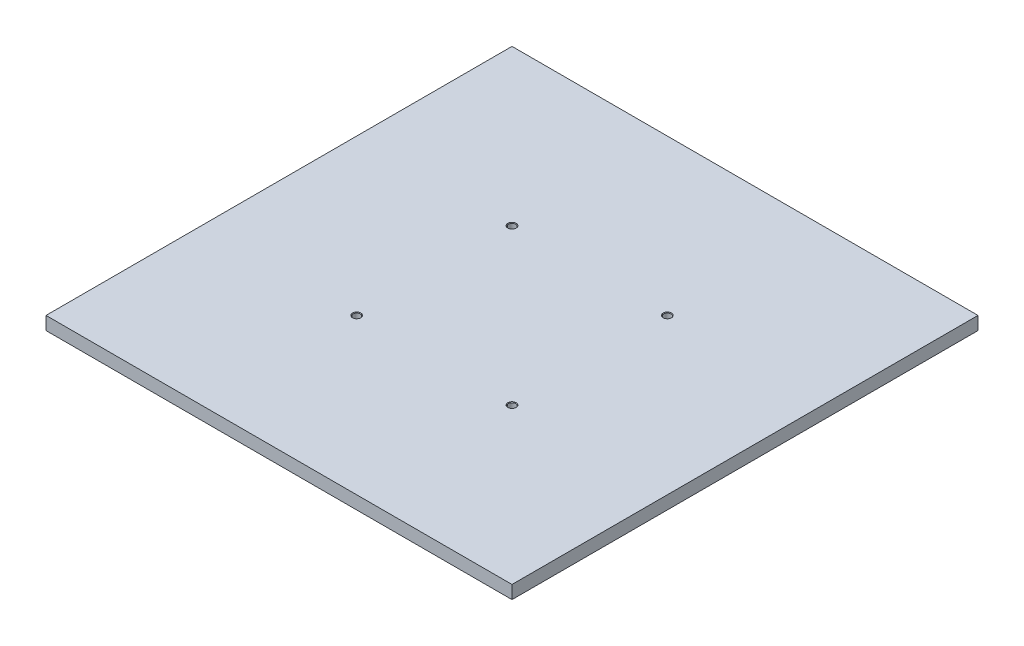
ISO-10303-21;
HEADER;
FILE_DESCRIPTION(('STEP AP214'),'2;1');
FILE_NAME('part.step','',(''),(''),'','','');
FILE_SCHEMA(('AUTOMOTIVE_DESIGN { 1 0 10303 214 1 1 1 1 }'));
ENDSEC;
DATA;
#1=APPLICATION_CONTEXT('core data for automotive mechanical design processes');
#2=APPLICATION_PROTOCOL_DEFINITION('international standard','automotive_design',2000,#1);
#3=PRODUCT_CONTEXT('',#1,'mechanical');
#4=PRODUCT('Part','Part','',(#3));
#5=PRODUCT_RELATED_PRODUCT_CATEGORY('part','',(#4));
#6=PRODUCT_DEFINITION_FORMATION('','',#4);
#7=PRODUCT_DEFINITION_CONTEXT('part definition',#1,'design');
#8=PRODUCT_DEFINITION('design','',#6,#7);
#9=PRODUCT_DEFINITION_SHAPE('','',#8);
#10=(LENGTH_UNIT() NAMED_UNIT(*) SI_UNIT(.MILLI.,.METRE.));
#11=(NAMED_UNIT(*) PLANE_ANGLE_UNIT() SI_UNIT($,.RADIAN.));
#12=(NAMED_UNIT(*) SI_UNIT($,.STERADIAN.) SOLID_ANGLE_UNIT());
#13=UNCERTAINTY_MEASURE_WITH_UNIT(LENGTH_MEASURE(1.E-05),#10,'distance_accuracy_value','');
#14=(GEOMETRIC_REPRESENTATION_CONTEXT(3) GLOBAL_UNCERTAINTY_ASSIGNED_CONTEXT((#13)) GLOBAL_UNIT_ASSIGNED_CONTEXT((#10,
#11,#12)) REPRESENTATION_CONTEXT('',''));
#15=CARTESIAN_POINT('',(0.,0.,0.));
#16=DIRECTION('',(0.,0.,1.));
#17=DIRECTION('',(1.,0.,0.));
#18=AXIS2_PLACEMENT_3D('',#15,#16,#17);
#19=CARTESIAN_POINT('',(225.,12.7,225.));
#20=DIRECTION('',(-1.,0.,0.));
#21=DIRECTION('',(0.,0.,1.));
#22=AXIS2_PLACEMENT_3D('',#19,#20,#21);
#23=PLANE('',#22);
#24=DIRECTION('',(0.,0.,-1.));
#25=VECTOR('',#24,1.);
#26=CARTESIAN_POINT('',(225.,0.,225.));
#27=LINE('',#26,#25);
#28=CARTESIAN_POINT('',(225.,0.,225.));
#29=VERTEX_POINT('',#28);
#30=CARTESIAN_POINT('',(225.,0.,-225.));
#31=VERTEX_POINT('',#30);
#32=EDGE_CURVE('E97',#29,#31,#27,.T.);
#33=ORIENTED_EDGE('',*,*,#32,.T.);
#34=DIRECTION('',(0.,-1.,0.));
#35=VECTOR('',#34,1.);
#36=CARTESIAN_POINT('',(225.,12.7,-225.));
#37=LINE('',#36,#35);
#38=CARTESIAN_POINT('',(225.,12.7,-225.));
#39=VERTEX_POINT('',#38);
#40=EDGE_CURVE('E11',#39,#31,#37,.T.);
#41=ORIENTED_EDGE('',*,*,#40,.F.);
#42=DIRECTION('',(0.,0.,-1.));
#43=VECTOR('',#42,1.);
#44=CARTESIAN_POINT('',(225.,12.7,225.));
#45=LINE('',#44,#43);
#46=CARTESIAN_POINT('',(225.,12.7,225.));
#47=VERTEX_POINT('',#46);
#48=EDGE_CURVE('E85',#47,#39,#45,.T.);
#49=ORIENTED_EDGE('',*,*,#48,.F.);
#50=DIRECTION('',(0.,-1.,0.));
#51=VECTOR('',#50,1.);
#52=CARTESIAN_POINT('',(225.,12.7,225.));
#53=LINE('',#52,#51);
#54=EDGE_CURVE('E93',#47,#29,#53,.T.);
#55=ORIENTED_EDGE('',*,*,#54,.T.);
#56=EDGE_LOOP('',(#33,#41,#49,#55));
#57=FACE_BOUND('',#56,.T.);
#58=ADVANCED_FACE('F34',(#57),#23,.F.);
#59=CARTESIAN_POINT('',(-225.,12.7,-225.));
#60=DIRECTION('',(0.,0.,1.));
#61=DIRECTION('',(1.,0.,0.));
#62=AXIS2_PLACEMENT_3D('',#59,#60,#61);
#63=PLANE('',#62);
#64=DIRECTION('',(-1.,0.,0.));
#65=VECTOR('',#64,1.);
#66=CARTESIAN_POINT('',(-225.,0.,-225.));
#67=LINE('',#66,#65);
#68=CARTESIAN_POINT('',(-225.,0.,-225.));
#69=VERTEX_POINT('',#68);
#70=EDGE_CURVE('E89',#31,#69,#67,.T.);
#71=ORIENTED_EDGE('',*,*,#70,.T.);
#72=DIRECTION('',(0.,-1.,0.));
#73=VECTOR('',#72,1.);
#74=CARTESIAN_POINT('',(-225.,12.7,-225.));
#75=LINE('',#74,#73);
#76=CARTESIAN_POINT('',(-225.,12.7,-225.));
#77=VERTEX_POINT('',#76);
#78=EDGE_CURVE('E42',#77,#69,#75,.T.);
#79=ORIENTED_EDGE('',*,*,#78,.F.);
#80=DIRECTION('',(-1.,0.,0.));
#81=VECTOR('',#80,1.);
#82=CARTESIAN_POINT('',(-225.,12.7,-225.));
#83=LINE('',#82,#81);
#84=EDGE_CURVE('E80',#39,#77,#83,.T.);
#85=ORIENTED_EDGE('',*,*,#84,.F.);
#86=ORIENTED_EDGE('',*,*,#40,.T.);
#87=EDGE_LOOP('',(#71,#79,#85,#86));
#88=FACE_BOUND('',#87,.T.);
#89=ADVANCED_FACE('F88',(#88),#63,.F.);
#90=CARTESIAN_POINT('',(-225.,12.7,225.));
#91=DIRECTION('',(1.,0.,0.));
#92=DIRECTION('',(0.,0.,-1.));
#93=AXIS2_PLACEMENT_3D('',#90,#91,#92);
#94=PLANE('',#93);
#95=DIRECTION('',(0.,0.,1.));
#96=VECTOR('',#95,1.);
#97=CARTESIAN_POINT('',(-225.,0.,225.));
#98=LINE('',#97,#96);
#99=CARTESIAN_POINT('',(-225.,0.,225.));
#100=VERTEX_POINT('',#99);
#101=EDGE_CURVE('E67',#69,#100,#98,.T.);
#102=ORIENTED_EDGE('',*,*,#101,.T.);
#103=DIRECTION('',(0.,-1.,0.));
#104=VECTOR('',#103,1.);
#105=CARTESIAN_POINT('',(-225.,12.7,225.));
#106=LINE('',#105,#104);
#107=CARTESIAN_POINT('',(-225.,12.7,225.));
#108=VERTEX_POINT('',#107);
#109=EDGE_CURVE('E90',#108,#100,#106,.T.);
#110=ORIENTED_EDGE('',*,*,#109,.F.);
#111=DIRECTION('',(0.,0.,1.));
#112=VECTOR('',#111,1.);
#113=CARTESIAN_POINT('',(-225.,12.7,225.));
#114=LINE('',#113,#112);
#115=EDGE_CURVE('E83',#77,#108,#114,.T.);
#116=ORIENTED_EDGE('',*,*,#115,.F.);
#117=ORIENTED_EDGE('',*,*,#78,.T.);
#118=EDGE_LOOP('',(#102,#110,#116,#117));
#119=FACE_BOUND('',#118,.T.);
#120=ADVANCED_FACE('F91',(#119),#94,.F.);
#121=CARTESIAN_POINT('',(-225.,12.7,225.));
#122=DIRECTION('',(0.,0.,-1.));
#123=DIRECTION('',(-1.,0.,0.));
#124=AXIS2_PLACEMENT_3D('',#121,#122,#123);
#125=PLANE('',#124);
#126=DIRECTION('',(1.,0.,0.));
#127=VECTOR('',#126,1.);
#128=CARTESIAN_POINT('',(-225.,0.,225.));
#129=LINE('',#128,#127);
#130=EDGE_CURVE('E73',#100,#29,#129,.T.);
#131=ORIENTED_EDGE('',*,*,#130,.T.);
#132=ORIENTED_EDGE('',*,*,#54,.F.);
#133=DIRECTION('',(1.,0.,0.));
#134=VECTOR('',#133,1.);
#135=CARTESIAN_POINT('',(-225.,12.7,225.));
#136=LINE('',#135,#134);
#137=EDGE_CURVE('E50',#108,#47,#136,.T.);
#138=ORIENTED_EDGE('',*,*,#137,.F.);
#139=ORIENTED_EDGE('',*,*,#109,.T.);
#140=EDGE_LOOP('',(#131,#132,#138,#139));
#141=FACE_BOUND('',#140,.T.);
#142=ADVANCED_FACE('F105',(#141),#125,.F.);
#143=CARTESIAN_POINT('',(0.,12.7,0.));
#144=DIRECTION('',(0.,-1.,0.));
#145=DIRECTION('',(0.,0.,-1.));
#146=AXIS2_PLACEMENT_3D('',#143,#144,#145);
#147=PLANE('',#146);
#148=CARTESIAN_POINT('',(-75.,12.7,-75.));
#149=DIRECTION('',(0.,1.,0.));
#150=DIRECTION('',(0.,0.,1.));
#151=AXIS2_PLACEMENT_3D('',#148,#149,#150);
#152=CIRCLE('',#151,4.025);
#153=CARTESIAN_POINT('',(-75.,12.7,-70.975));
#154=VERTEX_POINT('',#153);
#155=EDGE_CURVE('E143',#154,#154,#152,.T.);
#156=ORIENTED_EDGE('',*,*,#155,.F.);
#157=EDGE_LOOP('',(#156));
#158=FACE_BOUND('',#157,.T.);
#159=CARTESIAN_POINT('',(75.,12.7,-75.));
#160=DIRECTION('',(0.,1.,0.));
#161=DIRECTION('',(0.,0.,1.));
#162=AXIS2_PLACEMENT_3D('',#159,#160,#161);
#163=CIRCLE('',#162,4.025);
#164=CARTESIAN_POINT('',(75.,12.7,-70.975));
#165=VERTEX_POINT('',#164);
#166=EDGE_CURVE('E134',#165,#165,#163,.T.);
#167=ORIENTED_EDGE('',*,*,#166,.F.);
#168=EDGE_LOOP('',(#167));
#169=FACE_BOUND('',#168,.T.);
#170=CARTESIAN_POINT('',(75.,12.7,75.));
#171=DIRECTION('',(0.,1.,0.));
#172=DIRECTION('',(0.,0.,1.));
#173=AXIS2_PLACEMENT_3D('',#170,#171,#172);
#174=CIRCLE('',#173,4.025);
#175=CARTESIAN_POINT('',(75.,12.7,79.025));
#176=VERTEX_POINT('',#175);
#177=EDGE_CURVE('E125',#176,#176,#174,.T.);
#178=ORIENTED_EDGE('',*,*,#177,.F.);
#179=EDGE_LOOP('',(#178));
#180=FACE_BOUND('',#179,.T.);
#181=CARTESIAN_POINT('',(-75.,12.7,75.));
#182=DIRECTION('',(0.,1.,0.));
#183=DIRECTION('',(0.,0.,1.));
#184=AXIS2_PLACEMENT_3D('',#181,#182,#183);
#185=CIRCLE('',#184,4.025);
#186=CARTESIAN_POINT('',(-75.,12.7,79.025));
#187=VERTEX_POINT('',#186);
#188=EDGE_CURVE('E116',#187,#187,#185,.T.);
#189=ORIENTED_EDGE('',*,*,#188,.F.);
#190=EDGE_LOOP('',(#189));
#191=FACE_BOUND('',#190,.T.);
#192=ORIENTED_EDGE('',*,*,#48,.T.);
#193=ORIENTED_EDGE('',*,*,#84,.T.);
#194=ORIENTED_EDGE('',*,*,#115,.T.);
#195=ORIENTED_EDGE('',*,*,#137,.T.);
#196=EDGE_LOOP('',(#192,#193,#194,#195));
#197=FACE_BOUND('',#196,.T.);
#198=ADVANCED_FACE('F81',(#158,#169,#180,#191,#197),#147,.F.);
#199=CARTESIAN_POINT('',(0.,0.,0.));
#200=DIRECTION('',(0.,-1.,0.));
#201=DIRECTION('',(0.,0.,-1.));
#202=AXIS2_PLACEMENT_3D('',#199,#200,#201);
#203=PLANE('',#202);
#204=CARTESIAN_POINT('',(-75.,0.,-75.));
#205=DIRECTION('',(0.,1.,0.));
#206=DIRECTION('',(0.,0.,1.));
#207=AXIS2_PLACEMENT_3D('',#204,#205,#206);
#208=CIRCLE('',#207,3.5);
#209=CARTESIAN_POINT('',(-75.,0.,-71.5));
#210=VERTEX_POINT('',#209);
#211=EDGE_CURVE('E137',#210,#210,#208,.T.);
#212=ORIENTED_EDGE('',*,*,#211,.T.);
#213=EDGE_LOOP('',(#212));
#214=FACE_BOUND('',#213,.T.);
#215=CARTESIAN_POINT('',(75.,0.,-75.));
#216=DIRECTION('',(0.,1.,0.));
#217=DIRECTION('',(0.,0.,1.));
#218=AXIS2_PLACEMENT_3D('',#215,#216,#217);
#219=CIRCLE('',#218,3.5);
#220=CARTESIAN_POINT('',(75.,0.,-71.5));
#221=VERTEX_POINT('',#220);
#222=EDGE_CURVE('E128',#221,#221,#219,.T.);
#223=ORIENTED_EDGE('',*,*,#222,.T.);
#224=EDGE_LOOP('',(#223));
#225=FACE_BOUND('',#224,.T.);
#226=CARTESIAN_POINT('',(75.,0.,75.));
#227=DIRECTION('',(0.,1.,0.));
#228=DIRECTION('',(0.,0.,1.));
#229=AXIS2_PLACEMENT_3D('',#226,#227,#228);
#230=CIRCLE('',#229,3.5);
#231=CARTESIAN_POINT('',(75.,0.,78.5));
#232=VERTEX_POINT('',#231);
#233=EDGE_CURVE('E119',#232,#232,#230,.T.);
#234=ORIENTED_EDGE('',*,*,#233,.T.);
#235=EDGE_LOOP('',(#234));
#236=FACE_BOUND('',#235,.T.);
#237=CARTESIAN_POINT('',(-75.,0.,75.));
#238=DIRECTION('',(0.,1.,0.));
#239=DIRECTION('',(0.,0.,1.));
#240=AXIS2_PLACEMENT_3D('',#237,#238,#239);
#241=CIRCLE('',#240,3.5);
#242=CARTESIAN_POINT('',(-75.,0.,78.5));
#243=VERTEX_POINT('',#242);
#244=EDGE_CURVE('E100',#243,#243,#241,.T.);
#245=ORIENTED_EDGE('',*,*,#244,.T.);
#246=EDGE_LOOP('',(#245));
#247=FACE_BOUND('',#246,.T.);
#248=ORIENTED_EDGE('',*,*,#32,.F.);
#249=ORIENTED_EDGE('',*,*,#130,.F.);
#250=ORIENTED_EDGE('',*,*,#101,.F.);
#251=ORIENTED_EDGE('',*,*,#70,.F.);
#252=EDGE_LOOP('',(#248,#249,#250,#251));
#253=FACE_BOUND('',#252,.T.);
#254=ADVANCED_FACE('F108',(#214,#225,#236,#247,#253),#203,.T.);
#255=CARTESIAN_POINT('',(-75.,12.7,75.));
#256=DIRECTION('',(0.,1.,0.));
#257=DIRECTION('',(0.,0.,1.));
#258=AXIS2_PLACEMENT_3D('',#255,#256,#257);
#259=CYLINDRICAL_SURFACE('',#258,3.5);
#260=ORIENTED_EDGE('',*,*,#244,.F.);
#261=EDGE_LOOP('',(#260));
#262=FACE_BOUND('',#261,.T.);
#263=CARTESIAN_POINT('',(-75.,12.175,75.));
#264=DIRECTION('',(0.,1.,0.));
#265=DIRECTION('',(0.,0.,1.));
#266=AXIS2_PLACEMENT_3D('',#263,#264,#265);
#267=CIRCLE('',#266,3.5);
#268=CARTESIAN_POINT('',(-75.,12.175,78.5));
#269=VERTEX_POINT('',#268);
#270=EDGE_CURVE('E113',#269,#269,#267,.T.);
#271=ORIENTED_EDGE('',*,*,#270,.T.);
#272=EDGE_LOOP('',(#271));
#273=FACE_BOUND('',#272,.T.);
#274=ADVANCED_FACE('F161',(#262,#273),#259,.F.);
#275=CARTESIAN_POINT('',(-75.,12.7,75.));
#276=DIRECTION('',(0.,1.,0.));
#277=DIRECTION('',(0.,0.,1.));
#278=AXIS2_PLACEMENT_3D('',#275,#276,#277);
#279=CONICAL_SURFACE('',#278,4.025,0.78539816339744);
#280=ORIENTED_EDGE('',*,*,#270,.F.);
#281=EDGE_LOOP('',(#280));
#282=FACE_BOUND('',#281,.T.);
#283=ORIENTED_EDGE('',*,*,#188,.T.);
#284=EDGE_LOOP('',(#283));
#285=FACE_BOUND('',#284,.T.);
#286=ADVANCED_FACE('F158',(#282,#285),#279,.F.);
#287=CARTESIAN_POINT('',(75.,12.7,75.));
#288=DIRECTION('',(0.,1.,0.));
#289=DIRECTION('',(0.,0.,1.));
#290=AXIS2_PLACEMENT_3D('',#287,#288,#289);
#291=CYLINDRICAL_SURFACE('',#290,3.5);
#292=ORIENTED_EDGE('',*,*,#233,.F.);
#293=EDGE_LOOP('',(#292));
#294=FACE_BOUND('',#293,.T.);
#295=CARTESIAN_POINT('',(75.,12.175,75.));
#296=DIRECTION('',(0.,1.,0.));
#297=DIRECTION('',(0.,0.,1.));
#298=AXIS2_PLACEMENT_3D('',#295,#296,#297);
#299=CIRCLE('',#298,3.5);
#300=CARTESIAN_POINT('',(75.,12.175,78.5));
#301=VERTEX_POINT('',#300);
#302=EDGE_CURVE('E122',#301,#301,#299,.T.);
#303=ORIENTED_EDGE('',*,*,#302,.T.);
#304=EDGE_LOOP('',(#303));
#305=FACE_BOUND('',#304,.T.);
#306=ADVANCED_FACE('F160',(#294,#305),#291,.F.);
#307=CARTESIAN_POINT('',(75.,12.7,75.));
#308=DIRECTION('',(0.,1.,0.));
#309=DIRECTION('',(0.,0.,1.));
#310=AXIS2_PLACEMENT_3D('',#307,#308,#309);
#311=CONICAL_SURFACE('',#310,4.025,0.78539816339744);
#312=ORIENTED_EDGE('',*,*,#302,.F.);
#313=EDGE_LOOP('',(#312));
#314=FACE_BOUND('',#313,.T.);
#315=ORIENTED_EDGE('',*,*,#177,.T.);
#316=EDGE_LOOP('',(#315));
#317=FACE_BOUND('',#316,.T.);
#318=ADVANCED_FACE('F168',(#314,#317),#311,.F.);
#319=CARTESIAN_POINT('',(75.,12.7,-75.));
#320=DIRECTION('',(0.,1.,0.));
#321=DIRECTION('',(0.,0.,1.));
#322=AXIS2_PLACEMENT_3D('',#319,#320,#321);
#323=CYLINDRICAL_SURFACE('',#322,3.5);
#324=ORIENTED_EDGE('',*,*,#222,.F.);
#325=EDGE_LOOP('',(#324));
#326=FACE_BOUND('',#325,.T.);
#327=CARTESIAN_POINT('',(75.,12.175,-75.));
#328=DIRECTION('',(0.,1.,0.));
#329=DIRECTION('',(0.,0.,1.));
#330=AXIS2_PLACEMENT_3D('',#327,#328,#329);
#331=CIRCLE('',#330,3.5);
#332=CARTESIAN_POINT('',(75.,12.175,-71.5));
#333=VERTEX_POINT('',#332);
#334=EDGE_CURVE('E131',#333,#333,#331,.T.);
#335=ORIENTED_EDGE('',*,*,#334,.T.);
#336=EDGE_LOOP('',(#335));
#337=FACE_BOUND('',#336,.T.);
#338=ADVANCED_FACE('F202',(#326,#337),#323,.F.);
#339=CARTESIAN_POINT('',(75.,12.7,-75.));
#340=DIRECTION('',(0.,1.,0.));
#341=DIRECTION('',(0.,0.,1.));
#342=AXIS2_PLACEMENT_3D('',#339,#340,#341);
#343=CONICAL_SURFACE('',#342,4.025,0.78539816339744);
#344=ORIENTED_EDGE('',*,*,#334,.F.);
#345=EDGE_LOOP('',(#344));
#346=FACE_BOUND('',#345,.T.);
#347=ORIENTED_EDGE('',*,*,#166,.T.);
#348=EDGE_LOOP('',(#347));
#349=FACE_BOUND('',#348,.T.);
#350=ADVANCED_FACE('F207',(#346,#349),#343,.F.);
#351=CARTESIAN_POINT('',(-75.,12.7,-75.));
#352=DIRECTION('',(0.,1.,0.));
#353=DIRECTION('',(0.,0.,1.));
#354=AXIS2_PLACEMENT_3D('',#351,#352,#353);
#355=CYLINDRICAL_SURFACE('',#354,3.5);
#356=ORIENTED_EDGE('',*,*,#211,.F.);
#357=EDGE_LOOP('',(#356));
#358=FACE_BOUND('',#357,.T.);
#359=CARTESIAN_POINT('',(-75.,12.175,-75.));
#360=DIRECTION('',(0.,1.,0.));
#361=DIRECTION('',(0.,0.,1.));
#362=AXIS2_PLACEMENT_3D('',#359,#360,#361);
#363=CIRCLE('',#362,3.5);
#364=CARTESIAN_POINT('',(-75.,12.175,-71.5));
#365=VERTEX_POINT('',#364);
#366=EDGE_CURVE('E140',#365,#365,#363,.T.);
#367=ORIENTED_EDGE('',*,*,#366,.T.);
#368=EDGE_LOOP('',(#367));
#369=FACE_BOUND('',#368,.T.);
#370=ADVANCED_FACE('F213',(#358,#369),#355,.F.);
#371=CARTESIAN_POINT('',(-75.,12.7,-75.));
#372=DIRECTION('',(0.,1.,0.));
#373=DIRECTION('',(0.,0.,1.));
#374=AXIS2_PLACEMENT_3D('',#371,#372,#373);
#375=CONICAL_SURFACE('',#374,4.025,0.78539816339744);
#376=ORIENTED_EDGE('',*,*,#366,.F.);
#377=EDGE_LOOP('',(#376));
#378=FACE_BOUND('',#377,.T.);
#379=ORIENTED_EDGE('',*,*,#155,.T.);
#380=EDGE_LOOP('',(#379));
#381=FACE_BOUND('',#380,.T.);
#382=ADVANCED_FACE('F147',(#378,#381),#375,.F.);
#383=CLOSED_SHELL('',(#58,#89,#120,#142,#198,#254,#274,#286,#306,#318,#338,#350,#370,#382));
#384=MANIFOLD_SOLID_BREP('B2',#383);
#385=ADVANCED_BREP_SHAPE_REPRESENTATION('',(#18,#384),#14);
#386=SHAPE_DEFINITION_REPRESENTATION(#9,#385);
ENDSEC;
END-ISO-10303-21;
